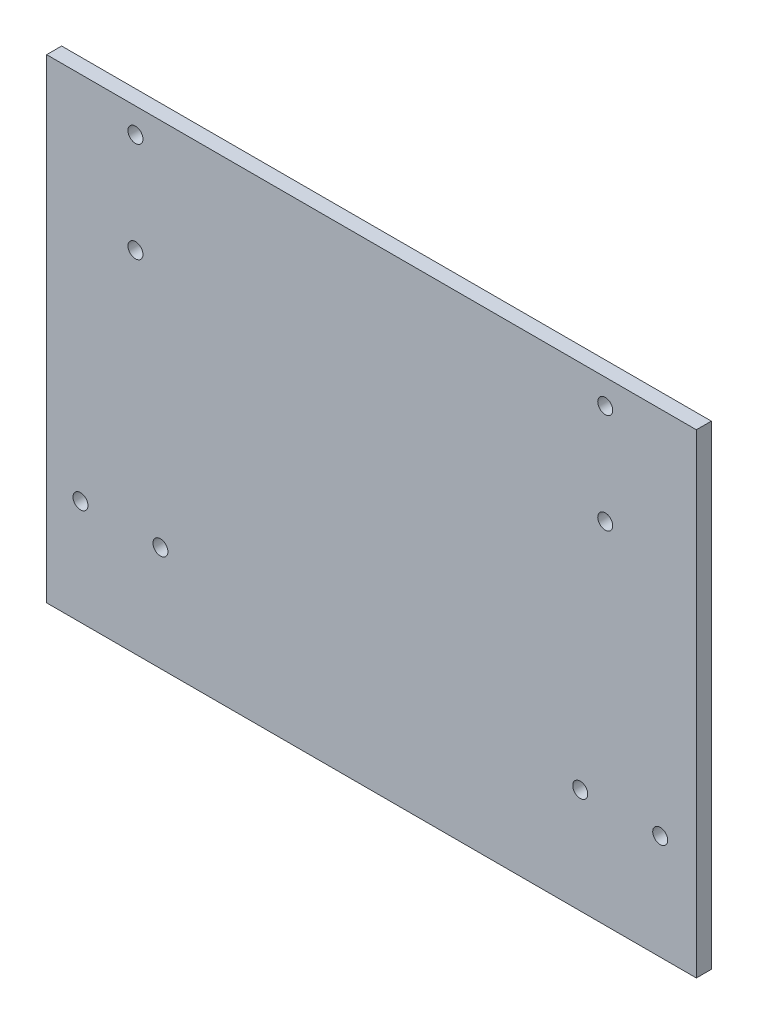
ISO-10303-21;
HEADER;
FILE_DESCRIPTION(('STEP AP214'),'2;1');
FILE_NAME('part.step','',(''),(''),'','','');
FILE_SCHEMA(('AUTOMOTIVE_DESIGN { 1 0 10303 214 1 1 1 1 }'));
ENDSEC;
DATA;
#1=APPLICATION_CONTEXT('core data for automotive mechanical design processes');
#2=APPLICATION_PROTOCOL_DEFINITION('international standard','automotive_design',2000,#1);
#3=PRODUCT_CONTEXT('',#1,'mechanical');
#4=PRODUCT('Part','Part','',(#3));
#5=PRODUCT_RELATED_PRODUCT_CATEGORY('part','',(#4));
#6=PRODUCT_DEFINITION_FORMATION('','',#4);
#7=PRODUCT_DEFINITION_CONTEXT('part definition',#1,'design');
#8=PRODUCT_DEFINITION('design','',#6,#7);
#9=PRODUCT_DEFINITION_SHAPE('','',#8);
#10=(LENGTH_UNIT() NAMED_UNIT(*) SI_UNIT(.MILLI.,.METRE.));
#11=(NAMED_UNIT(*) PLANE_ANGLE_UNIT() SI_UNIT($,.RADIAN.));
#12=(NAMED_UNIT(*) SI_UNIT($,.STERADIAN.) SOLID_ANGLE_UNIT());
#13=UNCERTAINTY_MEASURE_WITH_UNIT(LENGTH_MEASURE(1.E-05),#10,'distance_accuracy_value','');
#14=(GEOMETRIC_REPRESENTATION_CONTEXT(3) GLOBAL_UNCERTAINTY_ASSIGNED_CONTEXT((#13)) GLOBAL_UNIT_ASSIGNED_CONTEXT((#10,
#11,#12)) REPRESENTATION_CONTEXT('',''));
#15=CARTESIAN_POINT('',(0.,0.,0.));
#16=DIRECTION('',(0.,0.,1.));
#17=DIRECTION('',(1.,0.,0.));
#18=AXIS2_PLACEMENT_3D('',#15,#16,#17);
#19=CARTESIAN_POINT('',(-65.,-47.5,3.));
#20=DIRECTION('',(1.,0.,0.));
#21=DIRECTION('',(0.,0.,-1.));
#22=AXIS2_PLACEMENT_3D('',#19,#20,#21);
#23=PLANE('',#22);
#24=DIRECTION('',(0.,-1.,0.));
#25=VECTOR('',#24,1.);
#26=CARTESIAN_POINT('',(-65.,-47.5,0.));
#27=LINE('',#26,#25);
#28=CARTESIAN_POINT('',(-65.,47.5,0.));
#29=VERTEX_POINT('',#28);
#30=CARTESIAN_POINT('',(-65.,-47.5,0.));
#31=VERTEX_POINT('',#30);
#32=EDGE_CURVE('E110',#29,#31,#27,.T.);
#33=ORIENTED_EDGE('',*,*,#32,.T.);
#34=DIRECTION('',(0.,0.,-1.));
#35=VECTOR('',#34,1.);
#36=CARTESIAN_POINT('',(-65.,-47.5,3.));
#37=LINE('',#36,#35);
#38=CARTESIAN_POINT('',(-65.,-47.5,3.));
#39=VERTEX_POINT('',#38);
#40=EDGE_CURVE('E11',#39,#31,#37,.T.);
#41=ORIENTED_EDGE('',*,*,#40,.F.);
#42=DIRECTION('',(0.,-1.,0.));
#43=VECTOR('',#42,1.);
#44=CARTESIAN_POINT('',(-65.,-47.5,3.));
#45=LINE('',#44,#43);
#46=CARTESIAN_POINT('',(-65.,47.5,3.));
#47=VERTEX_POINT('',#46);
#48=EDGE_CURVE('E94',#47,#39,#45,.T.);
#49=ORIENTED_EDGE('',*,*,#48,.F.);
#50=DIRECTION('',(0.,0.,-1.));
#51=VECTOR('',#50,1.);
#52=CARTESIAN_POINT('',(-65.,47.5,3.));
#53=LINE('',#52,#51);
#54=EDGE_CURVE('E106',#47,#29,#53,.T.);
#55=ORIENTED_EDGE('',*,*,#54,.T.);
#56=EDGE_LOOP('',(#33,#41,#49,#55));
#57=FACE_BOUND('',#56,.T.);
#58=ADVANCED_FACE('F42',(#57),#23,.F.);
#59=CARTESIAN_POINT('',(65.,-47.5,3.));
#60=DIRECTION('',(0.,1.,0.));
#61=DIRECTION('',(-1.,0.,0.));
#62=AXIS2_PLACEMENT_3D('',#59,#60,#61);
#63=PLANE('',#62);
#64=DIRECTION('',(1.,0.,0.));
#65=VECTOR('',#64,1.);
#66=CARTESIAN_POINT('',(65.,-47.5,0.));
#67=LINE('',#66,#65);
#68=CARTESIAN_POINT('',(65.,-47.5,0.));
#69=VERTEX_POINT('',#68);
#70=EDGE_CURVE('E99',#31,#69,#67,.T.);
#71=ORIENTED_EDGE('',*,*,#70,.T.);
#72=DIRECTION('',(0.,0.,-1.));
#73=VECTOR('',#72,1.);
#74=CARTESIAN_POINT('',(65.,-47.5,3.));
#75=LINE('',#74,#73);
#76=CARTESIAN_POINT('',(65.,-47.5,3.));
#77=VERTEX_POINT('',#76);
#78=EDGE_CURVE('E51',#77,#69,#75,.T.);
#79=ORIENTED_EDGE('',*,*,#78,.F.);
#80=DIRECTION('',(1.,0.,0.));
#81=VECTOR('',#80,1.);
#82=CARTESIAN_POINT('',(65.,-47.5,3.));
#83=LINE('',#82,#81);
#84=EDGE_CURVE('E89',#39,#77,#83,.T.);
#85=ORIENTED_EDGE('',*,*,#84,.F.);
#86=ORIENTED_EDGE('',*,*,#40,.T.);
#87=EDGE_LOOP('',(#71,#79,#85,#86));
#88=FACE_BOUND('',#87,.T.);
#89=ADVANCED_FACE('F98',(#88),#63,.F.);
#90=CARTESIAN_POINT('',(65.,-47.5,3.));
#91=DIRECTION('',(-1.,0.,0.));
#92=DIRECTION('',(0.,0.,1.));
#93=AXIS2_PLACEMENT_3D('',#90,#91,#92);
#94=PLANE('',#93);
#95=DIRECTION('',(0.,1.,0.));
#96=VECTOR('',#95,1.);
#97=CARTESIAN_POINT('',(65.,-47.5,0.));
#98=LINE('',#97,#96);
#99=CARTESIAN_POINT('',(65.,47.5,0.));
#100=VERTEX_POINT('',#99);
#101=EDGE_CURVE('E76',#69,#100,#98,.T.);
#102=ORIENTED_EDGE('',*,*,#101,.T.);
#103=DIRECTION('',(0.,0.,-1.));
#104=VECTOR('',#103,1.);
#105=CARTESIAN_POINT('',(65.,47.5,3.));
#106=LINE('',#105,#104);
#107=CARTESIAN_POINT('',(65.,47.5,3.));
#108=VERTEX_POINT('',#107);
#109=EDGE_CURVE('E101',#108,#100,#106,.T.);
#110=ORIENTED_EDGE('',*,*,#109,.F.);
#111=DIRECTION('',(0.,1.,0.));
#112=VECTOR('',#111,1.);
#113=CARTESIAN_POINT('',(65.,-47.5,3.));
#114=LINE('',#113,#112);
#115=EDGE_CURVE('E92',#77,#108,#114,.T.);
#116=ORIENTED_EDGE('',*,*,#115,.F.);
#117=ORIENTED_EDGE('',*,*,#78,.T.);
#118=EDGE_LOOP('',(#102,#110,#116,#117));
#119=FACE_BOUND('',#118,.T.);
#120=ADVANCED_FACE('F102',(#119),#94,.F.);
#121=CARTESIAN_POINT('',(65.,47.5,3.));
#122=DIRECTION('',(0.,-1.,0.));
#123=DIRECTION('',(1.,0.,0.));
#124=AXIS2_PLACEMENT_3D('',#121,#122,#123);
#125=PLANE('',#124);
#126=DIRECTION('',(-1.,0.,0.));
#127=VECTOR('',#126,1.);
#128=CARTESIAN_POINT('',(65.,47.5,0.));
#129=LINE('',#128,#127);
#130=EDGE_CURVE('E82',#100,#29,#129,.T.);
#131=ORIENTED_EDGE('',*,*,#130,.T.);
#132=ORIENTED_EDGE('',*,*,#54,.F.);
#133=DIRECTION('',(-1.,0.,0.));
#134=VECTOR('',#133,1.);
#135=CARTESIAN_POINT('',(65.,47.5,3.));
#136=LINE('',#135,#134);
#137=EDGE_CURVE('E59',#108,#47,#136,.T.);
#138=ORIENTED_EDGE('',*,*,#137,.F.);
#139=ORIENTED_EDGE('',*,*,#109,.T.);
#140=EDGE_LOOP('',(#131,#132,#138,#139));
#141=FACE_BOUND('',#140,.T.);
#142=ADVANCED_FACE('F124',(#141),#125,.F.);
#143=CARTESIAN_POINT('',(0.,0.,3.));
#144=DIRECTION('',(0.,0.,1.));
#145=DIRECTION('',(1.,0.,0.));
#146=AXIS2_PLACEMENT_3D('',#143,#144,#145);
#147=PLANE('',#146);
#148=CARTESIAN_POINT('',(46.7671126155352,22.5,3.));
#149=DIRECTION('',(0.,0.,1.));
#150=DIRECTION('',(1.,0.,0.));
#151=AXIS2_PLACEMENT_3D('',#148,#149,#150);
#152=CIRCLE('',#151,1.5);
#153=CARTESIAN_POINT('',(48.2671126155352,22.5,3.));
#154=VERTEX_POINT('',#153);
#155=EDGE_CURVE('E152',#154,#154,#152,.T.);
#156=ORIENTED_EDGE('',*,*,#155,.F.);
#157=EDGE_LOOP('',(#156));
#158=FACE_BOUND('',#157,.T.);
#159=CARTESIAN_POINT('',(-47.2328873844649,42.5,3.));
#160=DIRECTION('',(0.,0.,1.));
#161=DIRECTION('',(1.,0.,0.));
#162=AXIS2_PLACEMENT_3D('',#159,#160,#161);
#163=CIRCLE('',#162,1.5);
#164=CARTESIAN_POINT('',(-45.7328873844649,42.5,3.));
#165=VERTEX_POINT('',#164);
#166=EDGE_CURVE('E166',#165,#165,#163,.T.);
#167=ORIENTED_EDGE('',*,*,#166,.F.);
#168=EDGE_LOOP('',(#167));
#169=FACE_BOUND('',#168,.T.);
#170=CARTESIAN_POINT('',(-47.2328873844649,22.5,3.));
#171=DIRECTION('',(0.,0.,1.));
#172=DIRECTION('',(1.,0.,0.));
#173=AXIS2_PLACEMENT_3D('',#170,#171,#172);
#174=CIRCLE('',#173,1.5);
#175=CARTESIAN_POINT('',(-45.7328873844649,22.5,3.));
#176=VERTEX_POINT('',#175);
#177=EDGE_CURVE('E170',#176,#176,#174,.T.);
#178=ORIENTED_EDGE('',*,*,#177,.F.);
#179=EDGE_LOOP('',(#178));
#180=FACE_BOUND('',#179,.T.);
#181=CARTESIAN_POINT('',(46.7671126155352,42.5,3.));
#182=DIRECTION('',(0.,0.,1.));
#183=DIRECTION('',(1.,0.,0.));
#184=AXIS2_PLACEMENT_3D('',#181,#182,#183);
#185=CIRCLE('',#184,1.5);
#186=CARTESIAN_POINT('',(48.2671126155352,42.5,3.));
#187=VERTEX_POINT('',#186);
#188=EDGE_CURVE('E174',#187,#187,#185,.T.);
#189=ORIENTED_EDGE('',*,*,#188,.F.);
#190=EDGE_LOOP('',(#189));
#191=FACE_BOUND('',#190,.T.);
#192=CARTESIAN_POINT('',(57.7671126155351,-26.5,3.));
#193=DIRECTION('',(0.,0.,1.));
#194=DIRECTION('',(1.,0.,0.));
#195=AXIS2_PLACEMENT_3D('',#192,#193,#194);
#196=CIRCLE('',#195,1.5);
#197=CARTESIAN_POINT('',(59.2671126155351,-26.5,3.));
#198=VERTEX_POINT('',#197);
#199=EDGE_CURVE('E114',#198,#198,#196,.T.);
#200=ORIENTED_EDGE('',*,*,#199,.F.);
#201=EDGE_LOOP('',(#200));
#202=FACE_BOUND('',#201,.T.);
#203=CARTESIAN_POINT('',(41.7671126155351,-26.5,3.));
#204=DIRECTION('',(0.,0.,1.));
#205=DIRECTION('',(1.,0.,0.));
#206=AXIS2_PLACEMENT_3D('',#203,#204,#205);
#207=CIRCLE('',#206,1.5);
#208=CARTESIAN_POINT('',(43.2671126155351,-26.5,3.));
#209=VERTEX_POINT('',#208);
#210=EDGE_CURVE('E134',#209,#209,#207,.T.);
#211=ORIENTED_EDGE('',*,*,#210,.F.);
#212=EDGE_LOOP('',(#211));
#213=FACE_BOUND('',#212,.T.);
#214=CARTESIAN_POINT('',(-42.2328873844649,-26.5,3.));
#215=DIRECTION('',(0.,0.,1.));
#216=DIRECTION('',(1.,0.,0.));
#217=AXIS2_PLACEMENT_3D('',#214,#215,#216);
#218=CIRCLE('',#217,1.5);
#219=CARTESIAN_POINT('',(-40.7328873844649,-26.5,3.));
#220=VERTEX_POINT('',#219);
#221=EDGE_CURVE('E138',#220,#220,#218,.T.);
#222=ORIENTED_EDGE('',*,*,#221,.F.);
#223=EDGE_LOOP('',(#222));
#224=FACE_BOUND('',#223,.T.);
#225=CARTESIAN_POINT('',(-58.2328873844649,-26.5,3.));
#226=DIRECTION('',(0.,0.,1.));
#227=DIRECTION('',(1.,0.,0.));
#228=AXIS2_PLACEMENT_3D('',#225,#226,#227);
#229=CIRCLE('',#228,1.5);
#230=CARTESIAN_POINT('',(-56.7328873844649,-26.5,3.));
#231=VERTEX_POINT('',#230);
#232=EDGE_CURVE('E142',#231,#231,#229,.T.);
#233=ORIENTED_EDGE('',*,*,#232,.F.);
#234=EDGE_LOOP('',(#233));
#235=FACE_BOUND('',#234,.T.);
#236=ORIENTED_EDGE('',*,*,#48,.T.);
#237=ORIENTED_EDGE('',*,*,#84,.T.);
#238=ORIENTED_EDGE('',*,*,#115,.T.);
#239=ORIENTED_EDGE('',*,*,#137,.T.);
#240=EDGE_LOOP('',(#236,#237,#238,#239));
#241=FACE_BOUND('',#240,.T.);
#242=ADVANCED_FACE('F90',(#158,#169,#180,#191,#202,#213,#224,#235,#241),#147,.T.);
#243=CARTESIAN_POINT('',(0.,0.,0.));
#244=DIRECTION('',(0.,0.,1.));
#245=DIRECTION('',(1.,0.,0.));
#246=AXIS2_PLACEMENT_3D('',#243,#244,#245);
#247=PLANE('',#246);
#248=CARTESIAN_POINT('',(46.7671126155352,22.5,0.));
#249=DIRECTION('',(0.,0.,-1.));
#250=DIRECTION('',(-1.,0.,0.));
#251=AXIS2_PLACEMENT_3D('',#248,#249,#250);
#252=CIRCLE('',#251,1.5);
#253=CARTESIAN_POINT('',(45.2671126155352,22.5,0.));
#254=VERTEX_POINT('',#253);
#255=EDGE_CURVE('E182',#254,#254,#252,.T.);
#256=ORIENTED_EDGE('',*,*,#255,.F.);
#257=EDGE_LOOP('',(#256));
#258=FACE_BOUND('',#257,.T.);
#259=CARTESIAN_POINT('',(-47.2328873844649,42.5,0.));
#260=DIRECTION('',(0.,0.,-1.));
#261=DIRECTION('',(-1.,0.,0.));
#262=AXIS2_PLACEMENT_3D('',#259,#260,#261);
#263=CIRCLE('',#262,1.5);
#264=CARTESIAN_POINT('',(-48.7328873844649,42.5,0.));
#265=VERTEX_POINT('',#264);
#266=EDGE_CURVE('E183',#265,#265,#263,.T.);
#267=ORIENTED_EDGE('',*,*,#266,.F.);
#268=EDGE_LOOP('',(#267));
#269=FACE_BOUND('',#268,.T.);
#270=CARTESIAN_POINT('',(-47.2328873844649,22.5,0.));
#271=DIRECTION('',(0.,0.,-1.));
#272=DIRECTION('',(-1.,0.,0.));
#273=AXIS2_PLACEMENT_3D('',#270,#271,#272);
#274=CIRCLE('',#273,1.5);
#275=CARTESIAN_POINT('',(-48.7328873844649,22.5,0.));
#276=VERTEX_POINT('',#275);
#277=EDGE_CURVE('E187',#276,#276,#274,.T.);
#278=ORIENTED_EDGE('',*,*,#277,.F.);
#279=EDGE_LOOP('',(#278));
#280=FACE_BOUND('',#279,.T.);
#281=CARTESIAN_POINT('',(46.7671126155352,42.5,0.));
#282=DIRECTION('',(0.,0.,-1.));
#283=DIRECTION('',(-1.,0.,0.));
#284=AXIS2_PLACEMENT_3D('',#281,#282,#283);
#285=CIRCLE('',#284,1.5);
#286=CARTESIAN_POINT('',(45.2671126155352,42.5,0.));
#287=VERTEX_POINT('',#286);
#288=EDGE_CURVE('E178',#287,#287,#285,.T.);
#289=ORIENTED_EDGE('',*,*,#288,.F.);
#290=EDGE_LOOP('',(#289));
#291=FACE_BOUND('',#290,.T.);
#292=CARTESIAN_POINT('',(57.7671126155351,-26.5,0.));
#293=DIRECTION('',(0.,0.,-1.));
#294=DIRECTION('',(-1.,0.,0.));
#295=AXIS2_PLACEMENT_3D('',#292,#293,#294);
#296=CIRCLE('',#295,1.5);
#297=CARTESIAN_POINT('',(56.2671126155351,-26.5,0.));
#298=VERTEX_POINT('',#297);
#299=EDGE_CURVE('E146',#298,#298,#296,.T.);
#300=ORIENTED_EDGE('',*,*,#299,.F.);
#301=EDGE_LOOP('',(#300));
#302=FACE_BOUND('',#301,.T.);
#303=CARTESIAN_POINT('',(41.7671126155351,-26.5,0.));
#304=DIRECTION('',(0.,0.,-1.));
#305=DIRECTION('',(-1.,0.,0.));
#306=AXIS2_PLACEMENT_3D('',#303,#304,#305);
#307=CIRCLE('',#306,1.5);
#308=CARTESIAN_POINT('',(40.2671126155351,-26.5,0.));
#309=VERTEX_POINT('',#308);
#310=EDGE_CURVE('E156',#309,#309,#307,.T.);
#311=ORIENTED_EDGE('',*,*,#310,.F.);
#312=EDGE_LOOP('',(#311));
#313=FACE_BOUND('',#312,.T.);
#314=CARTESIAN_POINT('',(-42.2328873844649,-26.5,0.));
#315=DIRECTION('',(0.,0.,-1.));
#316=DIRECTION('',(-1.,0.,0.));
#317=AXIS2_PLACEMENT_3D('',#314,#315,#316);
#318=CIRCLE('',#317,1.5);
#319=CARTESIAN_POINT('',(-43.7328873844649,-26.5,0.));
#320=VERTEX_POINT('',#319);
#321=EDGE_CURVE('E151',#320,#320,#318,.T.);
#322=ORIENTED_EDGE('',*,*,#321,.F.);
#323=EDGE_LOOP('',(#322));
#324=FACE_BOUND('',#323,.T.);
#325=CARTESIAN_POINT('',(-58.2328873844649,-26.5,0.));
#326=DIRECTION('',(0.,0.,-1.));
#327=DIRECTION('',(-1.,0.,0.));
#328=AXIS2_PLACEMENT_3D('',#325,#326,#327);
#329=CIRCLE('',#328,1.5);
#330=CARTESIAN_POINT('',(-59.7328873844649,-26.5,0.));
#331=VERTEX_POINT('',#330);
#332=EDGE_CURVE('E147',#331,#331,#329,.T.);
#333=ORIENTED_EDGE('',*,*,#332,.F.);
#334=EDGE_LOOP('',(#333));
#335=FACE_BOUND('',#334,.T.);
#336=ORIENTED_EDGE('',*,*,#32,.F.);
#337=ORIENTED_EDGE('',*,*,#130,.F.);
#338=ORIENTED_EDGE('',*,*,#101,.F.);
#339=ORIENTED_EDGE('',*,*,#70,.F.);
#340=EDGE_LOOP('',(#336,#337,#338,#339));
#341=FACE_BOUND('',#340,.T.);
#342=ADVANCED_FACE('F127',(#258,#269,#280,#291,#302,#313,#324,#335,#341),#247,.F.);
#343=CARTESIAN_POINT('',(-58.2328873844649,-26.5,10.));
#344=DIRECTION('',(0.,0.,-1.));
#345=DIRECTION('',(-1.,0.,0.));
#346=AXIS2_PLACEMENT_3D('',#343,#344,#345);
#347=CYLINDRICAL_SURFACE('',#346,1.5);
#348=ORIENTED_EDGE('',*,*,#232,.T.);
#349=EDGE_LOOP('',(#348));
#350=FACE_BOUND('',#349,.T.);
#351=ORIENTED_EDGE('',*,*,#332,.T.);
#352=EDGE_LOOP('',(#351));
#353=FACE_BOUND('',#352,.T.);
#354=ADVANCED_FACE('F199',(#350,#353),#347,.F.);
#355=CARTESIAN_POINT('',(-42.2328873844649,-26.5,10.));
#356=DIRECTION('',(0.,0.,-1.));
#357=DIRECTION('',(-1.,0.,0.));
#358=AXIS2_PLACEMENT_3D('',#355,#356,#357);
#359=CYLINDRICAL_SURFACE('',#358,1.5);
#360=ORIENTED_EDGE('',*,*,#221,.T.);
#361=EDGE_LOOP('',(#360));
#362=FACE_BOUND('',#361,.T.);
#363=ORIENTED_EDGE('',*,*,#321,.T.);
#364=EDGE_LOOP('',(#363));
#365=FACE_BOUND('',#364,.T.);
#366=ADVANCED_FACE('F213',(#362,#365),#359,.F.);
#367=CARTESIAN_POINT('',(41.7671126155351,-26.5,10.));
#368=DIRECTION('',(0.,0.,-1.));
#369=DIRECTION('',(-1.,0.,0.));
#370=AXIS2_PLACEMENT_3D('',#367,#368,#369);
#371=CYLINDRICAL_SURFACE('',#370,1.5);
#372=ORIENTED_EDGE('',*,*,#210,.T.);
#373=EDGE_LOOP('',(#372));
#374=FACE_BOUND('',#373,.T.);
#375=ORIENTED_EDGE('',*,*,#310,.T.);
#376=EDGE_LOOP('',(#375));
#377=FACE_BOUND('',#376,.T.);
#378=ADVANCED_FACE('F219',(#374,#377),#371,.F.);
#379=CARTESIAN_POINT('',(57.7671126155351,-26.5,10.));
#380=DIRECTION('',(0.,0.,-1.));
#381=DIRECTION('',(-1.,0.,0.));
#382=AXIS2_PLACEMENT_3D('',#379,#380,#381);
#383=CYLINDRICAL_SURFACE('',#382,1.5);
#384=ORIENTED_EDGE('',*,*,#199,.T.);
#385=EDGE_LOOP('',(#384));
#386=FACE_BOUND('',#385,.T.);
#387=ORIENTED_EDGE('',*,*,#299,.T.);
#388=EDGE_LOOP('',(#387));
#389=FACE_BOUND('',#388,.T.);
#390=ADVANCED_FACE('F256',(#386,#389),#383,.F.);
#391=CARTESIAN_POINT('',(46.7671126155352,42.5,10.));
#392=DIRECTION('',(0.,0.,-1.));
#393=DIRECTION('',(-1.,0.,0.));
#394=AXIS2_PLACEMENT_3D('',#391,#392,#393);
#395=CYLINDRICAL_SURFACE('',#394,1.5);
#396=ORIENTED_EDGE('',*,*,#188,.T.);
#397=EDGE_LOOP('',(#396));
#398=FACE_BOUND('',#397,.T.);
#399=ORIENTED_EDGE('',*,*,#288,.T.);
#400=EDGE_LOOP('',(#399));
#401=FACE_BOUND('',#400,.T.);
#402=ADVANCED_FACE('F261',(#398,#401),#395,.F.);
#403=CARTESIAN_POINT('',(-47.2328873844649,22.5,10.));
#404=DIRECTION('',(0.,0.,-1.));
#405=DIRECTION('',(-1.,0.,0.));
#406=AXIS2_PLACEMENT_3D('',#403,#404,#405);
#407=CYLINDRICAL_SURFACE('',#406,1.5);
#408=ORIENTED_EDGE('',*,*,#177,.T.);
#409=EDGE_LOOP('',(#408));
#410=FACE_BOUND('',#409,.T.);
#411=ORIENTED_EDGE('',*,*,#277,.T.);
#412=EDGE_LOOP('',(#411));
#413=FACE_BOUND('',#412,.T.);
#414=ADVANCED_FACE('F195',(#410,#413),#407,.F.);
#415=CARTESIAN_POINT('',(-47.2328873844649,42.5,10.));
#416=DIRECTION('',(0.,0.,-1.));
#417=DIRECTION('',(-1.,0.,0.));
#418=AXIS2_PLACEMENT_3D('',#415,#416,#417);
#419=CYLINDRICAL_SURFACE('',#418,1.5);
#420=ORIENTED_EDGE('',*,*,#166,.T.);
#421=EDGE_LOOP('',(#420));
#422=FACE_BOUND('',#421,.T.);
#423=ORIENTED_EDGE('',*,*,#266,.T.);
#424=EDGE_LOOP('',(#423));
#425=FACE_BOUND('',#424,.T.);
#426=ADVANCED_FACE('F268',(#422,#425),#419,.F.);
#427=CARTESIAN_POINT('',(46.7671126155352,22.5,10.));
#428=DIRECTION('',(0.,0.,-1.));
#429=DIRECTION('',(-1.,0.,0.));
#430=AXIS2_PLACEMENT_3D('',#427,#428,#429);
#431=CYLINDRICAL_SURFACE('',#430,1.5);
#432=ORIENTED_EDGE('',*,*,#155,.T.);
#433=EDGE_LOOP('',(#432));
#434=FACE_BOUND('',#433,.T.);
#435=ORIENTED_EDGE('',*,*,#255,.T.);
#436=EDGE_LOOP('',(#435));
#437=FACE_BOUND('',#436,.T.);
#438=ADVANCED_FACE('F271',(#434,#437),#431,.F.);
#439=CLOSED_SHELL('',(#58,#89,#120,#142,#242,#342,#354,#366,#378,#390,#402,#414,#426,#438));
#440=MANIFOLD_SOLID_BREP('B2',#439);
#441=ADVANCED_BREP_SHAPE_REPRESENTATION('',(#18,#440),#14);
#442=SHAPE_DEFINITION_REPRESENTATION(#9,#441);
ENDSEC;
END-ISO-10303-21;
